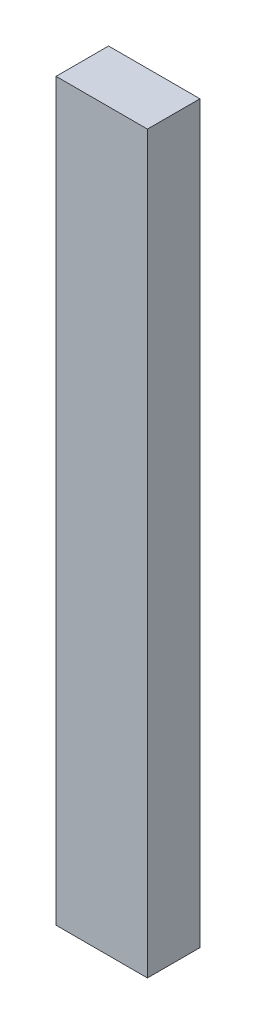
ISO-10303-21;
HEADER;
FILE_DESCRIPTION(('STEP AP214'),'2;1');
FILE_NAME('part.step','',(''),(''),'','','');
FILE_SCHEMA(('AUTOMOTIVE_DESIGN { 1 0 10303 214 1 1 1 1 }'));
ENDSEC;
DATA;
#1=APPLICATION_CONTEXT('core data for automotive mechanical design processes');
#2=APPLICATION_PROTOCOL_DEFINITION('international standard','automotive_design',2000,#1);
#3=PRODUCT_CONTEXT('',#1,'mechanical');
#4=PRODUCT('Part','Part','',(#3));
#5=PRODUCT_RELATED_PRODUCT_CATEGORY('part','',(#4));
#6=PRODUCT_DEFINITION_FORMATION('','',#4);
#7=PRODUCT_DEFINITION_CONTEXT('part definition',#1,'design');
#8=PRODUCT_DEFINITION('design','',#6,#7);
#9=PRODUCT_DEFINITION_SHAPE('','',#8);
#10=(LENGTH_UNIT() NAMED_UNIT(*) SI_UNIT(.MILLI.,.METRE.));
#11=(NAMED_UNIT(*) PLANE_ANGLE_UNIT() SI_UNIT($,.RADIAN.));
#12=(NAMED_UNIT(*) SI_UNIT($,.STERADIAN.) SOLID_ANGLE_UNIT());
#13=UNCERTAINTY_MEASURE_WITH_UNIT(LENGTH_MEASURE(1.E-05),#10,'distance_accuracy_value','');
#14=(GEOMETRIC_REPRESENTATION_CONTEXT(3) GLOBAL_UNCERTAINTY_ASSIGNED_CONTEXT((#13)) GLOBAL_UNIT_ASSIGNED_CONTEXT((#10,
#11,#12)) REPRESENTATION_CONTEXT('',''));
#15=CARTESIAN_POINT('',(0.,0.,0.));
#16=DIRECTION('',(0.,0.,1.));
#17=DIRECTION('',(1.,0.,0.));
#18=AXIS2_PLACEMENT_3D('',#15,#16,#17);
#19=CARTESIAN_POINT('',(-4.35,70.,-2.5));
#20=DIRECTION('',(0.,0.,-1.));
#21=DIRECTION('',(-1.,0.,0.));
#22=AXIS2_PLACEMENT_3D('',#19,#20,#21);
#23=PLANE('',#22);
#24=DIRECTION('',(1.,0.,0.));
#25=VECTOR('',#24,1.);
#26=CARTESIAN_POINT('',(-4.35,0.,-2.5));
#27=LINE('',#26,#25);
#28=CARTESIAN_POINT('',(-4.35,0.,-2.5));
#29=VERTEX_POINT('',#28);
#30=CARTESIAN_POINT('',(4.35,0.,-2.5));
#31=VERTEX_POINT('',#30);
#32=EDGE_CURVE('E109',#29,#31,#27,.T.);
#33=ORIENTED_EDGE('',*,*,#32,.F.);
#34=DIRECTION('',(0.,-1.,0.));
#35=VECTOR('',#34,1.);
#36=CARTESIAN_POINT('',(-4.35,70.,-2.5));
#37=LINE('',#36,#35);
#38=CARTESIAN_POINT('',(-4.35,70.,-2.5));
#39=VERTEX_POINT('',#38);
#40=EDGE_CURVE('E11',#39,#29,#37,.T.);
#41=ORIENTED_EDGE('',*,*,#40,.F.);
#42=DIRECTION('',(1.,0.,0.));
#43=VECTOR('',#42,1.);
#44=CARTESIAN_POINT('',(-4.35,70.,-2.5));
#45=LINE('',#44,#43);
#46=CARTESIAN_POINT('',(4.35,70.,-2.5));
#47=VERTEX_POINT('',#46);
#48=EDGE_CURVE('E101',#39,#47,#45,.T.);
#49=ORIENTED_EDGE('',*,*,#48,.T.);
#50=DIRECTION('',(0.,-1.,0.));
#51=VECTOR('',#50,1.);
#52=CARTESIAN_POINT('',(4.35,70.,-2.5));
#53=LINE('',#52,#51);
#54=EDGE_CURVE('E42',#47,#31,#53,.T.);
#55=ORIENTED_EDGE('',*,*,#54,.T.);
#56=EDGE_LOOP('',(#33,#41,#49,#55));
#57=FACE_BOUND('',#56,.T.);
#58=ADVANCED_FACE('F39',(#57),#23,.T.);
#59=CARTESIAN_POINT('',(-4.35,70.,2.5));
#60=DIRECTION('',(-1.,0.,0.));
#61=DIRECTION('',(0.,0.,1.));
#62=AXIS2_PLACEMENT_3D('',#59,#60,#61);
#63=PLANE('',#62);
#64=DIRECTION('',(0.,0.,-1.));
#65=VECTOR('',#64,1.);
#66=CARTESIAN_POINT('',(-4.35,0.,2.5));
#67=LINE('',#66,#65);
#68=CARTESIAN_POINT('',(-4.35,0.,2.5));
#69=VERTEX_POINT('',#68);
#70=EDGE_CURVE('E104',#69,#29,#67,.T.);
#71=ORIENTED_EDGE('',*,*,#70,.F.);
#72=DIRECTION('',(0.,-1.,0.));
#73=VECTOR('',#72,1.);
#74=CARTESIAN_POINT('',(-4.35,70.,2.5));
#75=LINE('',#74,#73);
#76=CARTESIAN_POINT('',(-4.35,70.,2.5));
#77=VERTEX_POINT('',#76);
#78=EDGE_CURVE('E49',#77,#69,#75,.T.);
#79=ORIENTED_EDGE('',*,*,#78,.F.);
#80=DIRECTION('',(0.,0.,-1.));
#81=VECTOR('',#80,1.);
#82=CARTESIAN_POINT('',(-4.35,70.,2.5));
#83=LINE('',#82,#81);
#84=EDGE_CURVE('E88',#77,#39,#83,.T.);
#85=ORIENTED_EDGE('',*,*,#84,.T.);
#86=ORIENTED_EDGE('',*,*,#40,.T.);
#87=EDGE_LOOP('',(#71,#79,#85,#86));
#88=FACE_BOUND('',#87,.T.);
#89=ADVANCED_FACE('F125',(#88),#63,.T.);
#90=CARTESIAN_POINT('',(-4.35,70.,2.5));
#91=DIRECTION('',(0.,0.,-1.));
#92=DIRECTION('',(-1.,0.,0.));
#93=AXIS2_PLACEMENT_3D('',#90,#91,#92);
#94=PLANE('',#93);
#95=DIRECTION('',(1.,0.,0.));
#96=VECTOR('',#95,1.);
#97=CARTESIAN_POINT('',(-4.35,0.,2.5));
#98=LINE('',#97,#96);
#99=CARTESIAN_POINT('',(4.35,0.,2.5));
#100=VERTEX_POINT('',#99);
#101=EDGE_CURVE('E94',#69,#100,#98,.T.);
#102=ORIENTED_EDGE('',*,*,#101,.T.);
#103=DIRECTION('',(0.,-1.,0.));
#104=VECTOR('',#103,1.);
#105=CARTESIAN_POINT('',(4.35,70.,2.5));
#106=LINE('',#105,#104);
#107=CARTESIAN_POINT('',(4.35,70.,2.5));
#108=VERTEX_POINT('',#107);
#109=EDGE_CURVE('E92',#108,#100,#106,.T.);
#110=ORIENTED_EDGE('',*,*,#109,.F.);
#111=DIRECTION('',(1.,0.,0.));
#112=VECTOR('',#111,1.);
#113=CARTESIAN_POINT('',(-4.35,70.,2.5));
#114=LINE('',#113,#112);
#115=EDGE_CURVE('E85',#77,#108,#114,.T.);
#116=ORIENTED_EDGE('',*,*,#115,.F.);
#117=ORIENTED_EDGE('',*,*,#78,.T.);
#118=EDGE_LOOP('',(#102,#110,#116,#117));
#119=FACE_BOUND('',#118,.T.);
#120=ADVANCED_FACE('F93',(#119),#94,.F.);
#121=CARTESIAN_POINT('',(4.35,70.,2.5));
#122=DIRECTION('',(-1.,0.,0.));
#123=DIRECTION('',(0.,0.,1.));
#124=AXIS2_PLACEMENT_3D('',#121,#122,#123);
#125=PLANE('',#124);
#126=DIRECTION('',(0.,0.,-1.));
#127=VECTOR('',#126,1.);
#128=CARTESIAN_POINT('',(4.35,0.,2.5));
#129=LINE('',#128,#127);
#130=EDGE_CURVE('E113',#100,#31,#129,.T.);
#131=ORIENTED_EDGE('',*,*,#130,.T.);
#132=ORIENTED_EDGE('',*,*,#54,.F.);
#133=DIRECTION('',(0.,0.,-1.));
#134=VECTOR('',#133,1.);
#135=CARTESIAN_POINT('',(4.35,70.,2.5));
#136=LINE('',#135,#134);
#137=EDGE_CURVE('E82',#108,#47,#136,.T.);
#138=ORIENTED_EDGE('',*,*,#137,.F.);
#139=ORIENTED_EDGE('',*,*,#109,.T.);
#140=EDGE_LOOP('',(#131,#132,#138,#139));
#141=FACE_BOUND('',#140,.T.);
#142=ADVANCED_FACE('F99',(#141),#125,.F.);
#143=CARTESIAN_POINT('',(0.,70.,0.));
#144=DIRECTION('',(0.,1.,0.));
#145=DIRECTION('',(0.,0.,1.));
#146=AXIS2_PLACEMENT_3D('',#143,#144,#145);
#147=PLANE('',#146);
#148=ORIENTED_EDGE('',*,*,#48,.F.);
#149=ORIENTED_EDGE('',*,*,#84,.F.);
#150=ORIENTED_EDGE('',*,*,#115,.T.);
#151=ORIENTED_EDGE('',*,*,#137,.T.);
#152=EDGE_LOOP('',(#148,#149,#150,#151));
#153=FACE_BOUND('',#152,.T.);
#154=ADVANCED_FACE('F87',(#153),#147,.T.);
#155=CARTESIAN_POINT('',(0.,0.,0.));
#156=DIRECTION('',(0.,1.,0.));
#157=DIRECTION('',(0.,0.,1.));
#158=AXIS2_PLACEMENT_3D('',#155,#156,#157);
#159=PLANE('',#158);
#160=ORIENTED_EDGE('',*,*,#32,.T.);
#161=ORIENTED_EDGE('',*,*,#130,.F.);
#162=ORIENTED_EDGE('',*,*,#101,.F.);
#163=ORIENTED_EDGE('',*,*,#70,.T.);
#164=EDGE_LOOP('',(#160,#161,#162,#163));
#165=FACE_BOUND('',#164,.T.);
#166=ADVANCED_FACE('F124',(#165),#159,.F.);
#167=CLOSED_SHELL('',(#58,#89,#120,#142,#154,#166));
#168=MANIFOLD_SOLID_BREP('B2',#167);
#169=ADVANCED_BREP_SHAPE_REPRESENTATION('',(#18,#168),#14);
#170=SHAPE_DEFINITION_REPRESENTATION(#9,#169);
ENDSEC;
END-ISO-10303-21;
